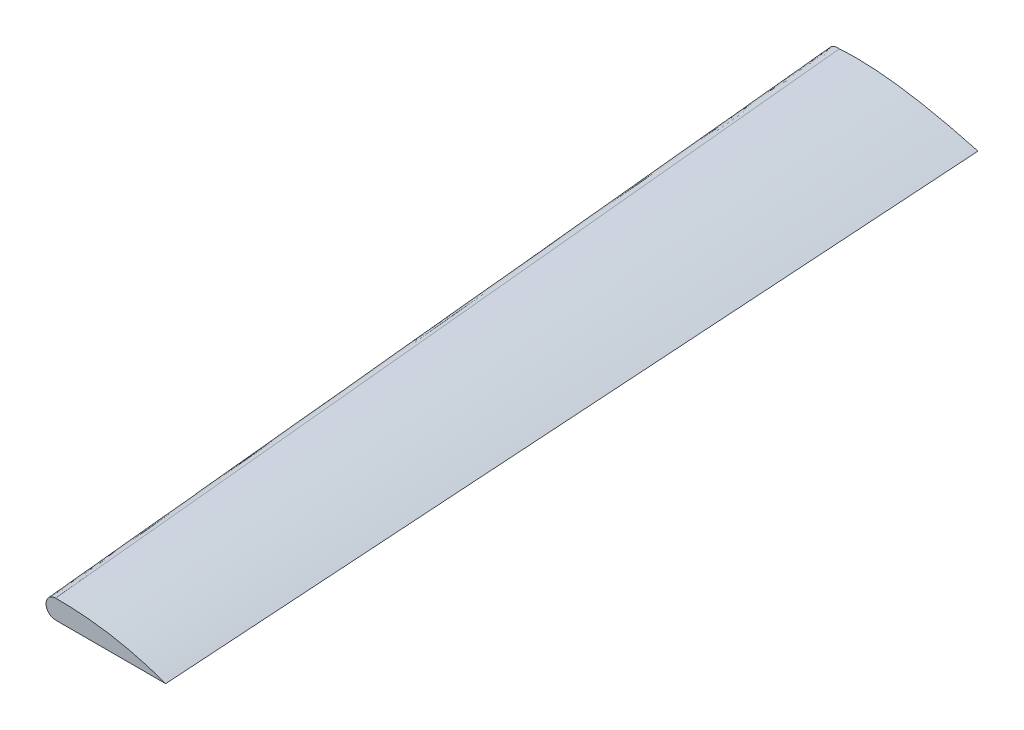
ISO-10303-21;
HEADER;
FILE_DESCRIPTION(('STEP AP214'),'2;1');
FILE_NAME('part.step','',(''),(''),'','','');
FILE_SCHEMA(('AUTOMOTIVE_DESIGN { 1 0 10303 214 1 1 1 1 }'));
ENDSEC;
DATA;
#1=APPLICATION_CONTEXT('core data for automotive mechanical design processes');
#2=APPLICATION_PROTOCOL_DEFINITION('international standard','automotive_design',2000,#1);
#3=PRODUCT_CONTEXT('',#1,'mechanical');
#4=PRODUCT('Part','Part','',(#3));
#5=PRODUCT_RELATED_PRODUCT_CATEGORY('part','',(#4));
#6=PRODUCT_DEFINITION_FORMATION('','',#4);
#7=PRODUCT_DEFINITION_CONTEXT('part definition',#1,'design');
#8=PRODUCT_DEFINITION('design','',#6,#7);
#9=PRODUCT_DEFINITION_SHAPE('','',#8);
#10=(LENGTH_UNIT() NAMED_UNIT(*) SI_UNIT(.MILLI.,.METRE.));
#11=(NAMED_UNIT(*) PLANE_ANGLE_UNIT() SI_UNIT($,.RADIAN.));
#12=(NAMED_UNIT(*) SI_UNIT($,.STERADIAN.) SOLID_ANGLE_UNIT());
#13=UNCERTAINTY_MEASURE_WITH_UNIT(LENGTH_MEASURE(1.E-05),#10,'distance_accuracy_value','');
#14=(GEOMETRIC_REPRESENTATION_CONTEXT(3) GLOBAL_UNCERTAINTY_ASSIGNED_CONTEXT((#13)) GLOBAL_UNIT_ASSIGNED_CONTEXT((#10,
#11,#12)) REPRESENTATION_CONTEXT('',''));
#15=CARTESIAN_POINT('',(0.,0.,0.));
#16=DIRECTION('',(0.,0.,1.));
#17=DIRECTION('',(1.,0.,0.));
#18=AXIS2_PLACEMENT_3D('',#15,#16,#17);
#19=CARTESIAN_POINT('',(0.,5.55951289391926,0.));
#20=DIRECTION('',(0.,0.,-1.));
#21=DIRECTION('',(-1.,0.,0.));
#22=AXIS2_PLACEMENT_3D('',#19,#20,#21);
#23=PLANE('',#22);
#24=CARTESIAN_POINT('',(0.,5.55951289391926,0.));
#25=DIRECTION('',(0.,0.,1.));
#26=DIRECTION('',(-1.,0.,0.));
#27=AXIS2_PLACEMENT_3D('',#24,#25,#26);
#28=CIRCLE('',#27,5.55951289391926);
#29=CARTESIAN_POINT('',(1.06204910181051,11.016639914889,0.));
#30=VERTEX_POINT('',#29);
#31=CARTESIAN_POINT('',(0.,0.,0.));
#32=VERTEX_POINT('',#31);
#33=EDGE_CURVE('E245',#30,#32,#28,.T.);
#34=ORIENTED_EDGE('',*,*,#33,.F.);
#35=CARTESIAN_POINT('',(81.0582898361399,0.,0.));
#36=CARTESIAN_POINT('',(31.1267356317844,13.5742836201117,0.));
#37=CARTESIAN_POINT('',(1.06204910181051,11.016639914889,0.));
#38=B_SPLINE_CURVE_WITH_KNOTS('',2,(#35,#36,#37),.UNSPECIFIED.,.F.,.F.,(3,3),(0.,
0.964413831713734),.UNSPECIFIED.);
#39=CARTESIAN_POINT('',(81.05828983614,0.,0.));
#40=VERTEX_POINT('',#39);
#41=EDGE_CURVE('E98',#40,#30,#38,.T.);
#42=ORIENTED_EDGE('',*,*,#41,.F.);
#43=DIRECTION('',(1.,0.,0.));
#44=VECTOR('',#43,1.);
#45=CARTESIAN_POINT('',(0.,0.,0.));
#46=LINE('',#45,#44);
#47=EDGE_CURVE('E12',#32,#40,#46,.T.);
#48=ORIENTED_EDGE('',*,*,#47,.F.);
#49=EDGE_LOOP('',(#34,#42,#48));
#50=FACE_BOUND('',#49,.T.);
#51=ADVANCED_FACE('F87',(#50),#23,.T.);
#52=CARTESIAN_POINT('',(49.30828983614,5.48661568487532,499.999999998));
#53=DIRECTION('',(0.,0.,-1.));
#54=DIRECTION('',(-1.,0.,0.));
#55=AXIS2_PLACEMENT_3D('',#52,#53,#54);
#56=PLANE('',#55);
#57=CARTESIAN_POINT('',(49.30828983614,5.48661568487532,499.999999998));
#58=DIRECTION('',(0.,0.,1.));
#59=DIRECTION('',(-1.,0.,0.));
#60=AXIS2_PLACEMENT_3D('',#57,#58,#59);
#61=CIRCLE('',#60,5.48661568487532);
#62=CARTESIAN_POINT('',(49.3082898361399,10.9732313697506,499.999999998));
#63=VERTEX_POINT('',#62);
#64=CARTESIAN_POINT('',(49.30828983614,0.,499.999999998));
#65=VERTEX_POINT('',#64);
#66=EDGE_CURVE('E135',#63,#65,#61,.T.);
#67=ORIENTED_EDGE('',*,*,#66,.T.);
#68=DIRECTION('',(1.,0.,0.));
#69=VECTOR('',#68,1.);
#70=CARTESIAN_POINT('',(49.30828983614,0.,499.999999998));
#71=LINE('',#70,#69);
#72=CARTESIAN_POINT('',(112.80828983614,0.,499.999999998));
#73=VERTEX_POINT('',#72);
#74=EDGE_CURVE('E130',#65,#73,#71,.T.);
#75=ORIENTED_EDGE('',*,*,#74,.T.);
#76=CARTESIAN_POINT('',(112.80828983614,0.,499.999999998));
#77=CARTESIAN_POINT('',(82.6475795030761,11.155844356227,499.999999998));
#78=CARTESIAN_POINT('',(49.3082898361399,10.9732313697506,499.999999998));
#79=B_SPLINE_CURVE_WITH_KNOTS('',2,(#76,#77,#78),.UNSPECIFIED.,.F.,.F.,(3,3),(0.,
0.895527604697483),.UNSPECIFIED.);
#80=EDGE_CURVE('E138',#73,#63,#79,.T.);
#81=ORIENTED_EDGE('',*,*,#80,.T.);
#82=EDGE_LOOP('',(#67,#75,#81));
#83=FACE_BOUND('',#82,.T.);
#84=ADVANCED_FACE('F145',(#83),#56,.F.);
#85=CARTESIAN_POINT('',(49.3082898361399,10.9732313697506,499.999999998));
#86=CARTESIAN_POINT('',(1.06204910181051,11.016639914889,0.));
#87=CARTESIAN_POINT('',(82.6475795030761,11.155844356227,499.999999998));
#88=CARTESIAN_POINT('',(31.1267356317844,13.5742836201117,0.));
#89=CARTESIAN_POINT('',(112.80828983614,0.,499.999999998));
#90=CARTESIAN_POINT('',(81.0582898361399,0.,0.));
#91=B_SPLINE_SURFACE_WITH_KNOTS('',2,1,((#85,#86),(#87,#88),(#89,#90)),.UNSPECIFIED.,.F.,.F.,
.F.,(3,3),(2,2),(0.,1.),(0.,1.),.UNSPECIFIED.);
#92=DIRECTION('',(-0.0633723619347512,0.,-0.99798995172437));
#93=VECTOR('',#92,1.);
#94=CARTESIAN_POINT('',(96.93328983614,0.,249.999999999));
#95=LINE('',#94,#93);
#96=EDGE_CURVE('E109',#73,#40,#95,.T.);
#97=DIRECTION('',(0.0960463828042846,-8.64157223418143E-05,0.995376855709703));
#98=VECTOR('',#97,1.);
#99=CARTESIAN_POINT('',(25.1851694689752,10.9949356423198,249.999999999));
#100=LINE('',#99,#98);
#101=EDGE_CURVE('E140',#30,#63,#100,.T.);
#102=ORIENTED_EDGE('',*,*,#80,.F.);
#103=ORIENTED_EDGE('',*,*,#96,.T.);
#104=ORIENTED_EDGE('',*,*,#41,.T.);
#105=ORIENTED_EDGE('',*,*,#101,.T.);
#106=EDGE_LOOP('',(#102,#103,#104,#105));
#107=FACE_BOUND('',#106,.T.);
#108=ADVANCED_FACE('F165',(#107),#91,.T.);
#109=CARTESIAN_POINT('',(112.80828983614,0.,499.999999998));
#110=CARTESIAN_POINT('',(81.05828983614,0.,0.));
#111=CARTESIAN_POINT('',(107.424785582321,0.,499.999999998));
#112=CARTESIAN_POINT('',(74.4174774061977,0.,0.));
#113=CARTESIAN_POINT('',(96.7990087009381,0.,499.999999998));
#114=CARTESIAN_POINT('',(60.9691356296689,0.,0.));
#115=CARTESIAN_POINT('',(81.0582898361399,0.,499.999999997999));
#116=CARTESIAN_POINT('',(40.5291449180699,0.,0.));
#117=CARTESIAN_POINT('',(65.317570971342,0.,499.999999998));
#118=CARTESIAN_POINT('',(20.0891542064712,0.,0.));
#119=CARTESIAN_POINT('',(54.6917940899589,0.,499.999999998));
#120=CARTESIAN_POINT('',(6.64081242994222,0.,0.));
#121=CARTESIAN_POINT('',(48.636012321386,0.,499.999999998));
#122=CARTESIAN_POINT('',(-0.829286773208637,0.,0.));
#123=CARTESIAN_POINT('',(47.2594654599175,0.250197051166799,499.999999998));
#124=CARTESIAN_POINT('',(-2.43504127940775,0.3731998066258,0.));
#125=CARTESIAN_POINT('',(45.4147962510894,1.41666556086865,499.999999997999));
#126=CARTESIAN_POINT('',(-4.32093253185678,1.81332672511354,0.));
#127=CARTESIAN_POINT('',(44.1294766670638,3.25631808875129,499.999999998));
#128=CARTESIAN_POINT('',(-5.44670858017831,3.83448561580333,0.));
#129=CARTESIAN_POINT('',(43.6672909808015,5.48661568487531,499.999999997999));
#130=CARTESIAN_POINT('',(-5.68508621580218,6.10757843439753,0.));
#131=CARTESIAN_POINT('',(44.1294766670637,7.71691328099925,499.999999998));
#132=CARTESIAN_POINT('',(-5.01686342474776,8.29327126748856,0.));
#133=CARTESIAN_POINT('',(45.4147962510895,9.55656580888196,499.999999997999));
#134=CARTESIAN_POINT('',(-3.52571248481619,10.0621477037413,0.));
#135=CARTESIAN_POINT('',(47.2594654599173,10.7230343185838,499.999999998));
#136=CARTESIAN_POINT('',(-1.39944102215757,11.1154857427868,0.));
#137=CARTESIAN_POINT('',(48.636012321386,10.9732313697506,499.999999998));
#138=CARTESIAN_POINT('',(0.248034754769531,11.1750608574131,0.));
#139=CARTESIAN_POINT('',(49.3082898361399,10.9732313697506,499.999999998));
#140=CARTESIAN_POINT('',(1.06204910181052,11.016639914889,0.));
#141=B_SPLINE_SURFACE_WITH_KNOTS('',3,1,((#109,#110),(#111,#112),(#113,#114),(#115,#116),(#117,
#118),(#119,#120),(#121,#122),(#123,#124),(#125,#126),(#127,#128),(#129,#130),(#131,#132),(#133,
#134),(#135,#136),(#137,#138),(#139,#140)),.UNSPECIFIED.,.F.,.F.,.F.,(4,1,1,1,2,1,1,1,1,1,1,1,
4),(2,2),(0.,0.200039269071797,0.400078538143594,0.600117807215391,0.800157076287188,
0.82513744175129,0.850117807215391,0.875098172679493,0.900078538143594,0.925058903607696,
0.950039269071797,0.975019634535899,1.),(0.,1.),.UNSPECIFIED.);
#142=ORIENTED_EDGE('',*,*,#74,.F.);
#143=ORIENTED_EDGE('',*,*,#66,.F.);
#144=ORIENTED_EDGE('',*,*,#101,.F.);
#145=ORIENTED_EDGE('',*,*,#33,.T.);
#146=ORIENTED_EDGE('',*,*,#47,.T.);
#147=ORIENTED_EDGE('',*,*,#96,.F.);
#148=EDGE_LOOP('',(#142,#143,#144,#145,#146,#147));
#149=FACE_BOUND('',#148,.T.);
#150=ADVANCED_FACE('F127',(#149),#141,.T.);
#151=CLOSED_SHELL('',(#51,#84,#108,#150));
#152=MANIFOLD_SOLID_BREP('B2',#151);
#153=ADVANCED_BREP_SHAPE_REPRESENTATION('',(#18,#152),#14);
#154=SHAPE_DEFINITION_REPRESENTATION(#9,#153);
ENDSEC;
END-ISO-10303-21;
